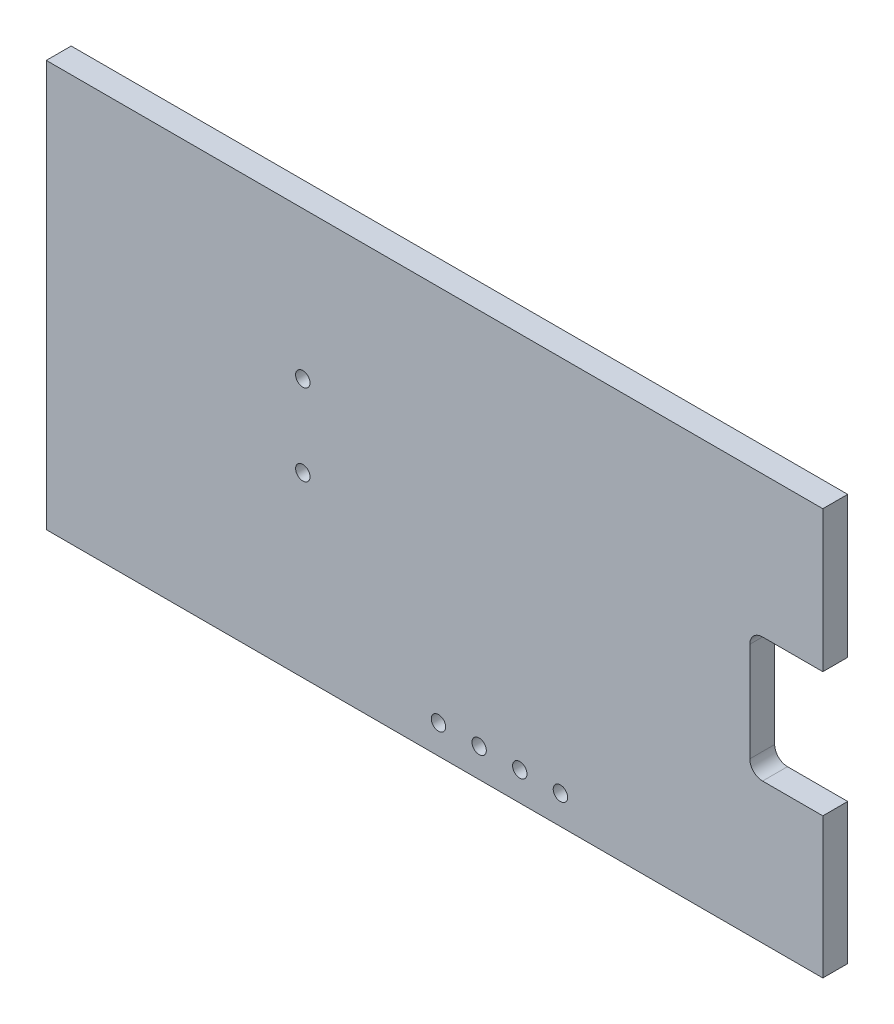
ISO-10303-21;
HEADER;
FILE_DESCRIPTION(('STEP AP214'),'2;1');
FILE_NAME('part.step','',(''),(''),'','','');
FILE_SCHEMA(('AUTOMOTIVE_DESIGN { 1 0 10303 214 1 1 1 1 }'));
ENDSEC;
DATA;
#1=APPLICATION_CONTEXT('core data for automotive mechanical design processes');
#2=APPLICATION_PROTOCOL_DEFINITION('international standard','automotive_design',2000,#1);
#3=PRODUCT_CONTEXT('',#1,'mechanical');
#4=PRODUCT('Part','Part','',(#3));
#5=PRODUCT_RELATED_PRODUCT_CATEGORY('part','',(#4));
#6=PRODUCT_DEFINITION_FORMATION('','',#4);
#7=PRODUCT_DEFINITION_CONTEXT('part definition',#1,'design');
#8=PRODUCT_DEFINITION('design','',#6,#7);
#9=PRODUCT_DEFINITION_SHAPE('','',#8);
#10=(LENGTH_UNIT() NAMED_UNIT(*) SI_UNIT(.MILLI.,.METRE.));
#11=(NAMED_UNIT(*) PLANE_ANGLE_UNIT() SI_UNIT($,.RADIAN.));
#12=(NAMED_UNIT(*) SI_UNIT($,.STERADIAN.) SOLID_ANGLE_UNIT());
#13=UNCERTAINTY_MEASURE_WITH_UNIT(LENGTH_MEASURE(1.E-05),#10,'distance_accuracy_value','');
#14=(GEOMETRIC_REPRESENTATION_CONTEXT(3) GLOBAL_UNCERTAINTY_ASSIGNED_CONTEXT((#13)) GLOBAL_UNIT_ASSIGNED_CONTEXT((#10,
#11,#12)) REPRESENTATION_CONTEXT('',''));
#15=CARTESIAN_POINT('',(0.,0.,0.));
#16=DIRECTION('',(0.,0.,1.));
#17=DIRECTION('',(1.,0.,0.));
#18=AXIS2_PLACEMENT_3D('',#15,#16,#17);
#19=CARTESIAN_POINT('',(91.56800076,85.90000092,1.55600146));
#20=DIRECTION('',(0.,0.,1.));
#21=DIRECTION('',(1.,0.,0.));
#22=AXIS2_PLACEMENT_3D('',#19,#20,#21);
#23=PLANE('',#22);
#24=CARTESIAN_POINT('',(107.6000007,102.07999904,1.55600146));
#25=DIRECTION('',(0.,0.,-1.));
#26=DIRECTION('',(-1.,0.,0.));
#27=AXIS2_PLACEMENT_3D('',#24,#25,#26);
#28=CIRCLE('',#27,0.4499991);
#29=CARTESIAN_POINT('',(107.1500016,102.07999904,1.55600146));
#30=VERTEX_POINT('',#29);
#31=EDGE_CURVE('E147',#30,#30,#28,.T.);
#32=ORIENTED_EDGE('',*,*,#31,.T.);
#33=EDGE_LOOP('',(#32));
#34=FACE_BOUND('',#33,.T.);
#35=CARTESIAN_POINT('',(107.6000007,96.99999904,1.55600146));
#36=DIRECTION('',(0.,0.,-1.));
#37=DIRECTION('',(-1.,0.,0.));
#38=AXIS2_PLACEMENT_3D('',#35,#36,#37);
#39=CIRCLE('',#38,0.4499991);
#40=CARTESIAN_POINT('',(107.1500016,96.99999904,1.55600146));
#41=VERTEX_POINT('',#40);
#42=EDGE_CURVE('E214',#41,#41,#39,.T.);
#43=ORIENTED_EDGE('',*,*,#42,.T.);
#44=EDGE_LOOP('',(#43));
#45=FACE_BOUND('',#44,.T.);
#46=CARTESIAN_POINT('',(116.07999898,87.69999986,1.55600146));
#47=DIRECTION('',(0.,0.,-1.));
#48=DIRECTION('',(-1.,0.,0.));
#49=AXIS2_PLACEMENT_3D('',#46,#47,#48);
#50=CIRCLE('',#49,0.4499991);
#51=CARTESIAN_POINT('',(115.62999988,87.69999986,1.55600146));
#52=VERTEX_POINT('',#51);
#53=EDGE_CURVE('E217',#52,#52,#50,.T.);
#54=ORIENTED_EDGE('',*,*,#53,.T.);
#55=EDGE_LOOP('',(#54));
#56=FACE_BOUND('',#55,.T.);
#57=CARTESIAN_POINT('',(118.61999898,87.69999986,1.55600146));
#58=DIRECTION('',(0.,0.,-1.));
#59=DIRECTION('',(-1.,0.,0.));
#60=AXIS2_PLACEMENT_3D('',#57,#58,#59);
#61=CIRCLE('',#60,0.4499991);
#62=CARTESIAN_POINT('',(118.16999988,87.69999986,1.55600146));
#63=VERTEX_POINT('',#62);
#64=EDGE_CURVE('E220',#63,#63,#61,.T.);
#65=ORIENTED_EDGE('',*,*,#64,.T.);
#66=EDGE_LOOP('',(#65));
#67=FACE_BOUND('',#66,.T.);
#68=CARTESIAN_POINT('',(121.15999898,87.69999986,1.55600146));
#69=DIRECTION('',(0.,0.,-1.));
#70=DIRECTION('',(-1.,0.,0.));
#71=AXIS2_PLACEMENT_3D('',#68,#69,#70);
#72=CIRCLE('',#71,0.4499991);
#73=CARTESIAN_POINT('',(120.70999988,87.69999986,1.55600146));
#74=VERTEX_POINT('',#73);
#75=EDGE_CURVE('E223',#74,#74,#72,.T.);
#76=ORIENTED_EDGE('',*,*,#75,.T.);
#77=EDGE_LOOP('',(#76));
#78=FACE_BOUND('',#77,.T.);
#79=CARTESIAN_POINT('',(123.69999898,87.69999986,1.55600146));
#80=DIRECTION('',(0.,0.,-1.));
#81=DIRECTION('',(-1.,0.,0.));
#82=AXIS2_PLACEMENT_3D('',#79,#80,#81);
#83=CIRCLE('',#82,0.4499991);
#84=CARTESIAN_POINT('',(123.24999988,87.69999986,1.55600146));
#85=VERTEX_POINT('',#84);
#86=EDGE_CURVE('E181',#85,#85,#83,.T.);
#87=ORIENTED_EDGE('',*,*,#86,.T.);
#88=EDGE_LOOP('',(#87));
#89=FACE_BOUND('',#88,.T.);
#90=DIRECTION('',(0.,1.,0.));
#91=VECTOR('',#90,1.);
#92=CARTESIAN_POINT('',(140.0999992,111.30000092,1.55600146));
#93=LINE('',#92,#91);
#94=CARTESIAN_POINT('',(140.0999992,111.30000092,1.55600146));
#95=VERTEX_POINT('',#94);
#96=CARTESIAN_POINT('',(140.0999992,102.47739982,1.55600146));
#97=VERTEX_POINT('',#96);
#98=EDGE_CURVE('E173',#95,#97,#93,.F.);
#99=ORIENTED_EDGE('',*,*,#98,.F.);
#100=DIRECTION('',(1.,0.,0.));
#101=VECTOR('',#100,1.);
#102=CARTESIAN_POINT('',(91.56800076,111.30000092,1.55600146));
#103=LINE('',#102,#101);
#104=CARTESIAN_POINT('',(91.56800076,111.30000092,1.55600146));
#105=VERTEX_POINT('',#104);
#106=EDGE_CURVE('E153',#105,#95,#103,.T.);
#107=ORIENTED_EDGE('',*,*,#106,.F.);
#108=DIRECTION('',(0.,1.,0.));
#109=VECTOR('',#108,1.);
#110=CARTESIAN_POINT('',(91.56800076,85.90000092,1.55600146));
#111=LINE('',#110,#109);
#112=CARTESIAN_POINT('',(91.56800076,85.90000092,1.55600146));
#113=VERTEX_POINT('',#112);
#114=EDGE_CURVE('E163',#113,#105,#111,.T.);
#115=ORIENTED_EDGE('',*,*,#114,.F.);
#116=DIRECTION('',(1.,0.,0.));
#117=VECTOR('',#116,1.);
#118=CARTESIAN_POINT('',(140.0999992,85.90000092,1.55600146));
#119=LINE('',#118,#117);
#120=CARTESIAN_POINT('',(140.0999992,85.90000092,1.55600146));
#121=VERTEX_POINT('',#120);
#122=EDGE_CURVE('E142',#121,#113,#119,.F.);
#123=ORIENTED_EDGE('',*,*,#122,.F.);
#124=DIRECTION('',(0.,1.,0.));
#125=VECTOR('',#124,1.);
#126=CARTESIAN_POINT('',(140.0999992,94.67740018,1.55600146));
#127=LINE('',#126,#125);
#128=CARTESIAN_POINT('',(140.0999992,94.67740018,1.55600146));
#129=VERTEX_POINT('',#128);
#130=EDGE_CURVE('E132',#129,#121,#127,.F.);
#131=ORIENTED_EDGE('',*,*,#130,.F.);
#132=DIRECTION('',(1.,0.,0.));
#133=VECTOR('',#132,1.);
#134=CARTESIAN_POINT('',(140.0999992,94.67740018,1.55600146));
#135=LINE('',#134,#133);
#136=CARTESIAN_POINT('',(136.33440119543,94.6774001800001,1.55600146));
#137=VERTEX_POINT('',#136);
#138=EDGE_CURVE('E91',#129,#137,#135,.F.);
#139=ORIENTED_EDGE('',*,*,#138,.T.);
#140=CARTESIAN_POINT('',(136.33440145086,95.477401630868,1.55600146));
#141=DIRECTION('',(0.,0.,-1.));
#142=DIRECTION('',(-1.,0.,0.));
#143=AXIS2_PLACEMENT_3D('',#140,#141,#142);
#144=CIRCLE('',#143,0.800001450868);
#145=CARTESIAN_POINT('',(135.5344,95.477401375434,1.55600146));
#146=VERTEX_POINT('',#145);
#147=EDGE_CURVE('E20',#137,#146,#144,.T.);
#148=ORIENTED_EDGE('',*,*,#147,.T.);
#149=DIRECTION('',(0.,1.,0.));
#150=VECTOR('',#149,1.);
#151=CARTESIAN_POINT('',(135.5344,95.47740112,1.55600146));
#152=LINE('',#151,#150);
#153=CARTESIAN_POINT('',(135.534399999996,101.67739836913,1.55600146));
#154=VERTEX_POINT('',#153);
#155=EDGE_CURVE('E95',#146,#154,#152,.T.);
#156=ORIENTED_EDGE('',*,*,#155,.T.);
#157=CARTESIAN_POINT('',(136.33440145086,101.67739836913,1.55600146));
#158=DIRECTION('',(0.,0.,-1.));
#159=DIRECTION('',(-1.,0.,0.));
#160=AXIS2_PLACEMENT_3D('',#157,#158,#159);
#161=CIRCLE('',#160,0.800001450868);
#162=CARTESIAN_POINT('',(136.33440119543,102.47739982,1.55600146));
#163=VERTEX_POINT('',#162);
#164=EDGE_CURVE('E227',#154,#163,#161,.T.);
#165=ORIENTED_EDGE('',*,*,#164,.T.);
#166=DIRECTION('',(1.,0.,0.));
#167=VECTOR('',#166,1.);
#168=CARTESIAN_POINT('',(136.33440094,102.47739982,1.55600146));
#169=LINE('',#168,#167);
#170=EDGE_CURVE('E170',#163,#97,#169,.T.);
#171=ORIENTED_EDGE('',*,*,#170,.T.);
#172=EDGE_LOOP('',(#99,#107,#115,#123,#131,#139,#148,#156,#165,#171));
#173=FACE_BOUND('',#172,.T.);
#174=ADVANCED_FACE('F17',(#34,#45,#56,#67,#78,#89,#173),#23,.T.);
#175=CARTESIAN_POINT('',(91.56800076,85.90000092,0.));
#176=DIRECTION('',(-1.,0.,0.));
#177=DIRECTION('',(0.,0.,1.));
#178=AXIS2_PLACEMENT_3D('',#175,#176,#177);
#179=PLANE('',#178);
#180=DIRECTION('',(0.,0.,1.));
#181=VECTOR('',#180,1.);
#182=CARTESIAN_POINT('',(91.56800076,111.30000092,0.));
#183=LINE('',#182,#181);
#184=CARTESIAN_POINT('',(91.56800076,111.30000092,0.));
#185=VERTEX_POINT('',#184);
#186=EDGE_CURVE('E150',#185,#105,#183,.T.);
#187=ORIENTED_EDGE('',*,*,#186,.F.);
#188=DIRECTION('',(0.,1.,0.));
#189=VECTOR('',#188,1.);
#190=CARTESIAN_POINT('',(91.56800076,85.90000092,0.));
#191=LINE('',#190,#189);
#192=CARTESIAN_POINT('',(91.56800076,85.90000092,0.));
#193=VERTEX_POINT('',#192);
#194=EDGE_CURVE('E137',#185,#193,#191,.F.);
#195=ORIENTED_EDGE('',*,*,#194,.T.);
#196=DIRECTION('',(0.,0.,-1.));
#197=VECTOR('',#196,1.);
#198=CARTESIAN_POINT('',(91.56800076,85.90000092,0.));
#199=LINE('',#198,#197);
#200=EDGE_CURVE('E140',#113,#193,#199,.T.);
#201=ORIENTED_EDGE('',*,*,#200,.F.);
#202=ORIENTED_EDGE('',*,*,#114,.T.);
#203=EDGE_LOOP('',(#187,#195,#201,#202));
#204=FACE_BOUND('',#203,.T.);
#205=ADVANCED_FACE('F272',(#204),#179,.T.);
#206=CARTESIAN_POINT('',(140.0999992,85.90000092,0.));
#207=DIRECTION('',(0.,-1.,0.));
#208=DIRECTION('',(0.,0.,-1.));
#209=AXIS2_PLACEMENT_3D('',#206,#207,#208);
#210=PLANE('',#209);
#211=ORIENTED_EDGE('',*,*,#200,.T.);
#212=DIRECTION('',(1.,0.,0.));
#213=VECTOR('',#212,1.);
#214=CARTESIAN_POINT('',(91.56800076,85.90000092,0.));
#215=LINE('',#214,#213);
#216=CARTESIAN_POINT('',(140.0999992,85.90000092,0.));
#217=VERTEX_POINT('',#216);
#218=EDGE_CURVE('E128',#193,#217,#215,.T.);
#219=ORIENTED_EDGE('',*,*,#218,.T.);
#220=DIRECTION('',(0.,0.,-1.));
#221=VECTOR('',#220,1.);
#222=CARTESIAN_POINT('',(140.0999992,85.90000092,0.));
#223=LINE('',#222,#221);
#224=EDGE_CURVE('E121',#121,#217,#223,.T.);
#225=ORIENTED_EDGE('',*,*,#224,.F.);
#226=ORIENTED_EDGE('',*,*,#122,.T.);
#227=EDGE_LOOP('',(#211,#219,#225,#226));
#228=FACE_BOUND('',#227,.T.);
#229=ADVANCED_FACE('F267',(#228),#210,.T.);
#230=CARTESIAN_POINT('',(140.0999992,94.67740018,0.));
#231=DIRECTION('',(1.,0.,0.));
#232=DIRECTION('',(0.,0.,-1.));
#233=AXIS2_PLACEMENT_3D('',#230,#231,#232);
#234=PLANE('',#233);
#235=ORIENTED_EDGE('',*,*,#224,.T.);
#236=DIRECTION('',(0.,1.,0.));
#237=VECTOR('',#236,1.);
#238=CARTESIAN_POINT('',(140.0999992,85.90000092,0.));
#239=LINE('',#238,#237);
#240=CARTESIAN_POINT('',(140.0999992,94.67740018,0.));
#241=VERTEX_POINT('',#240);
#242=EDGE_CURVE('E124',#217,#241,#239,.T.);
#243=ORIENTED_EDGE('',*,*,#242,.T.);
#244=DIRECTION('',(0.,0.,-1.));
#245=VECTOR('',#244,1.);
#246=CARTESIAN_POINT('',(140.0999992,94.67740018,0.));
#247=LINE('',#246,#245);
#248=EDGE_CURVE('E118',#241,#129,#247,.F.);
#249=ORIENTED_EDGE('',*,*,#248,.T.);
#250=ORIENTED_EDGE('',*,*,#130,.T.);
#251=EDGE_LOOP('',(#235,#243,#249,#250));
#252=FACE_BOUND('',#251,.T.);
#253=ADVANCED_FACE('F263',(#252),#234,.T.);
#254=CARTESIAN_POINT('',(140.0999992,94.67740018,0.));
#255=DIRECTION('',(0.,-1.,0.));
#256=DIRECTION('',(0.,0.,-1.));
#257=AXIS2_PLACEMENT_3D('',#254,#255,#256);
#258=PLANE('',#257);
#259=DIRECTION('',(0.,0.,-1.));
#260=VECTOR('',#259,1.);
#261=CARTESIAN_POINT('',(136.33440094,94.6774001800002,0.));
#262=LINE('',#261,#260);
#263=CARTESIAN_POINT('',(136.33440119543,94.6774001800001,0.));
#264=VERTEX_POINT('',#263);
#265=EDGE_CURVE('E101',#264,#137,#262,.F.);
#266=ORIENTED_EDGE('',*,*,#265,.T.);
#267=ORIENTED_EDGE('',*,*,#138,.F.);
#268=ORIENTED_EDGE('',*,*,#248,.F.);
#269=DIRECTION('',(1.,0.,0.));
#270=VECTOR('',#269,1.);
#271=CARTESIAN_POINT('',(91.56800076,94.67740018,0.));
#272=LINE('',#271,#270);
#273=EDGE_CURVE('E127',#241,#264,#272,.F.);
#274=ORIENTED_EDGE('',*,*,#273,.T.);
#275=EDGE_LOOP('',(#266,#267,#268,#274));
#276=FACE_BOUND('',#275,.T.);
#277=ADVANCED_FACE('F259',(#276),#258,.F.);
#278=CARTESIAN_POINT('',(136.33440145086,95.477401630868,0.));
#279=DIRECTION('',(0.,0.,-1.));
#280=DIRECTION('',(-1.,0.,0.));
#281=AXIS2_PLACEMENT_3D('',#278,#279,#280);
#282=CYLINDRICAL_SURFACE('',#281,0.800001450868);
#283=DIRECTION('',(0.,0.,1.));
#284=VECTOR('',#283,1.);
#285=CARTESIAN_POINT('',(135.5344,95.47740112,0.));
#286=LINE('',#285,#284);
#287=CARTESIAN_POINT('',(135.5344,95.477401375434,0.));
#288=VERTEX_POINT('',#287);
#289=EDGE_CURVE('E100',#288,#146,#286,.T.);
#290=ORIENTED_EDGE('',*,*,#289,.T.);
#291=ORIENTED_EDGE('',*,*,#147,.F.);
#292=ORIENTED_EDGE('',*,*,#265,.F.);
#293=CARTESIAN_POINT('',(136.33440145086,95.477401630868,0.));
#294=DIRECTION('',(0.,0.,-1.));
#295=DIRECTION('',(-1.,0.,0.));
#296=AXIS2_PLACEMENT_3D('',#293,#294,#295);
#297=CIRCLE('',#296,0.800001450868);
#298=EDGE_CURVE('E112',#264,#288,#297,.T.);
#299=ORIENTED_EDGE('',*,*,#298,.T.);
#300=EDGE_LOOP('',(#290,#291,#292,#299));
#301=FACE_BOUND('',#300,.T.);
#302=ADVANCED_FACE('F110',(#301),#282,.F.);
#303=CARTESIAN_POINT('',(135.5344,95.47740112,0.));
#304=DIRECTION('',(-1.,0.,0.));
#305=DIRECTION('',(0.,0.,1.));
#306=AXIS2_PLACEMENT_3D('',#303,#304,#305);
#307=PLANE('',#306);
#308=DIRECTION('',(0.,0.,-1.));
#309=VECTOR('',#308,1.);
#310=CARTESIAN_POINT('',(135.534399999992,101.67739836913,0.));
#311=LINE('',#310,#309);
#312=CARTESIAN_POINT('',(135.534399999996,101.67739836913,0.));
#313=VERTEX_POINT('',#312);
#314=EDGE_CURVE('E107',#313,#154,#311,.F.);
#315=ORIENTED_EDGE('',*,*,#314,.T.);
#316=ORIENTED_EDGE('',*,*,#155,.F.);
#317=ORIENTED_EDGE('',*,*,#289,.F.);
#318=DIRECTION('',(0.,1.,0.));
#319=VECTOR('',#318,1.);
#320=CARTESIAN_POINT('',(135.5344,85.90000092,0.));
#321=LINE('',#320,#319);
#322=EDGE_CURVE('E210',#288,#313,#321,.T.);
#323=ORIENTED_EDGE('',*,*,#322,.T.);
#324=EDGE_LOOP('',(#315,#316,#317,#323));
#325=FACE_BOUND('',#324,.T.);
#326=ADVANCED_FACE('F104',(#325),#307,.F.);
#327=CARTESIAN_POINT('',(136.33440145086,101.67739836913,0.));
#328=DIRECTION('',(0.,0.,-1.));
#329=DIRECTION('',(-1.,0.,0.));
#330=AXIS2_PLACEMENT_3D('',#327,#328,#329);
#331=CYLINDRICAL_SURFACE('',#330,0.800001450868);
#332=DIRECTION('',(0.,0.,1.));
#333=VECTOR('',#332,1.);
#334=CARTESIAN_POINT('',(136.33440094,102.47739982,0.));
#335=LINE('',#334,#333);
#336=CARTESIAN_POINT('',(136.33440119543,102.47739982,0.));
#337=VERTEX_POINT('',#336);
#338=EDGE_CURVE('E174',#337,#163,#335,.T.);
#339=ORIENTED_EDGE('',*,*,#338,.T.);
#340=ORIENTED_EDGE('',*,*,#164,.F.);
#341=ORIENTED_EDGE('',*,*,#314,.F.);
#342=CARTESIAN_POINT('',(136.33440145086,101.67739836913,0.));
#343=DIRECTION('',(0.,0.,-1.));
#344=DIRECTION('',(-1.,0.,0.));
#345=AXIS2_PLACEMENT_3D('',#342,#343,#344);
#346=CIRCLE('',#345,0.800001450868);
#347=EDGE_CURVE('E206',#313,#337,#346,.T.);
#348=ORIENTED_EDGE('',*,*,#347,.T.);
#349=EDGE_LOOP('',(#339,#340,#341,#348));
#350=FACE_BOUND('',#349,.T.);
#351=ADVANCED_FACE('F359',(#350),#331,.F.);
#352=CARTESIAN_POINT('',(136.33440094,102.47739982,0.));
#353=DIRECTION('',(0.,1.,0.));
#354=DIRECTION('',(0.,0.,1.));
#355=AXIS2_PLACEMENT_3D('',#352,#353,#354);
#356=PLANE('',#355);
#357=DIRECTION('',(0.,0.,-1.));
#358=VECTOR('',#357,1.);
#359=CARTESIAN_POINT('',(140.0999992,102.47739982,0.));
#360=LINE('',#359,#358);
#361=CARTESIAN_POINT('',(140.0999992,102.47739982,0.));
#362=VERTEX_POINT('',#361);
#363=EDGE_CURVE('E154',#97,#362,#360,.T.);
#364=ORIENTED_EDGE('',*,*,#363,.F.);
#365=ORIENTED_EDGE('',*,*,#170,.F.);
#366=ORIENTED_EDGE('',*,*,#338,.F.);
#367=DIRECTION('',(1.,0.,0.));
#368=VECTOR('',#367,1.);
#369=CARTESIAN_POINT('',(91.56800076,102.47739982,0.));
#370=LINE('',#369,#368);
#371=EDGE_CURVE('E209',#337,#362,#370,.T.);
#372=ORIENTED_EDGE('',*,*,#371,.T.);
#373=EDGE_LOOP('',(#364,#365,#366,#372));
#374=FACE_BOUND('',#373,.T.);
#375=ADVANCED_FACE('F251',(#374),#356,.F.);
#376=CARTESIAN_POINT('',(140.0999992,111.30000092,0.));
#377=DIRECTION('',(1.,0.,0.));
#378=DIRECTION('',(0.,0.,-1.));
#379=AXIS2_PLACEMENT_3D('',#376,#377,#378);
#380=PLANE('',#379);
#381=ORIENTED_EDGE('',*,*,#363,.T.);
#382=DIRECTION('',(0.,1.,0.));
#383=VECTOR('',#382,1.);
#384=CARTESIAN_POINT('',(140.0999992,85.90000092,0.));
#385=LINE('',#384,#383);
#386=CARTESIAN_POINT('',(140.0999992,111.30000092,0.));
#387=VERTEX_POINT('',#386);
#388=EDGE_CURVE('E160',#362,#387,#385,.T.);
#389=ORIENTED_EDGE('',*,*,#388,.T.);
#390=DIRECTION('',(0.,0.,1.));
#391=VECTOR('',#390,1.);
#392=CARTESIAN_POINT('',(140.0999992,111.30000092,0.));
#393=LINE('',#392,#391);
#394=EDGE_CURVE('E35',#95,#387,#393,.F.);
#395=ORIENTED_EDGE('',*,*,#394,.F.);
#396=ORIENTED_EDGE('',*,*,#98,.T.);
#397=EDGE_LOOP('',(#381,#389,#395,#396));
#398=FACE_BOUND('',#397,.T.);
#399=ADVANCED_FACE('F244',(#398),#380,.T.);
#400=CARTESIAN_POINT('',(91.56800076,111.30000092,0.));
#401=DIRECTION('',(0.,1.,0.));
#402=DIRECTION('',(0.,0.,1.));
#403=AXIS2_PLACEMENT_3D('',#400,#401,#402);
#404=PLANE('',#403);
#405=ORIENTED_EDGE('',*,*,#394,.T.);
#406=DIRECTION('',(1.,0.,0.));
#407=VECTOR('',#406,1.);
#408=CARTESIAN_POINT('',(91.56800076,111.30000092,0.));
#409=LINE('',#408,#407);
#410=EDGE_CURVE('E157',#387,#185,#409,.F.);
#411=ORIENTED_EDGE('',*,*,#410,.T.);
#412=ORIENTED_EDGE('',*,*,#186,.T.);
#413=ORIENTED_EDGE('',*,*,#106,.T.);
#414=EDGE_LOOP('',(#405,#411,#412,#413));
#415=FACE_BOUND('',#414,.T.);
#416=ADVANCED_FACE('F274',(#415),#404,.T.);
#417=CARTESIAN_POINT('',(123.69999898,87.69999986,0.));
#418=DIRECTION('',(0.,0.,-1.));
#419=DIRECTION('',(-1.,0.,0.));
#420=AXIS2_PLACEMENT_3D('',#417,#418,#419);
#421=CYLINDRICAL_SURFACE('',#420,0.4499991);
#422=ORIENTED_EDGE('',*,*,#86,.F.);
#423=EDGE_LOOP('',(#422));
#424=FACE_BOUND('',#423,.T.);
#425=CARTESIAN_POINT('',(123.69999898,87.69999986,0.));
#426=DIRECTION('',(0.,0.,-1.));
#427=DIRECTION('',(-1.,0.,0.));
#428=AXIS2_PLACEMENT_3D('',#425,#426,#427);
#429=CIRCLE('',#428,0.4499991);
#430=CARTESIAN_POINT('',(123.24999988,87.69999986,0.));
#431=VERTEX_POINT('',#430);
#432=EDGE_CURVE('E159',#431,#431,#429,.T.);
#433=ORIENTED_EDGE('',*,*,#432,.T.);
#434=EDGE_LOOP('',(#433));
#435=FACE_BOUND('',#434,.T.);
#436=ADVANCED_FACE('F276',(#424,#435),#421,.F.);
#437=CARTESIAN_POINT('',(121.15999898,87.69999986,0.));
#438=DIRECTION('',(0.,0.,-1.));
#439=DIRECTION('',(-1.,0.,0.));
#440=AXIS2_PLACEMENT_3D('',#437,#438,#439);
#441=CYLINDRICAL_SURFACE('',#440,0.4499991);
#442=ORIENTED_EDGE('',*,*,#75,.F.);
#443=EDGE_LOOP('',(#442));
#444=FACE_BOUND('',#443,.T.);
#445=CARTESIAN_POINT('',(121.15999898,87.69999986,0.));
#446=DIRECTION('',(0.,0.,-1.));
#447=DIRECTION('',(-1.,0.,0.));
#448=AXIS2_PLACEMENT_3D('',#445,#446,#447);
#449=CIRCLE('',#448,0.4499991);
#450=CARTESIAN_POINT('',(120.70999988,87.69999986,0.));
#451=VERTEX_POINT('',#450);
#452=EDGE_CURVE('E201',#451,#451,#449,.T.);
#453=ORIENTED_EDGE('',*,*,#452,.T.);
#454=EDGE_LOOP('',(#453));
#455=FACE_BOUND('',#454,.T.);
#456=ADVANCED_FACE('F283',(#444,#455),#441,.F.);
#457=CARTESIAN_POINT('',(118.61999898,87.69999986,0.));
#458=DIRECTION('',(0.,0.,-1.));
#459=DIRECTION('',(-1.,0.,0.));
#460=AXIS2_PLACEMENT_3D('',#457,#458,#459);
#461=CYLINDRICAL_SURFACE('',#460,0.4499991);
#462=ORIENTED_EDGE('',*,*,#64,.F.);
#463=EDGE_LOOP('',(#462));
#464=FACE_BOUND('',#463,.T.);
#465=CARTESIAN_POINT('',(118.61999898,87.69999986,0.));
#466=DIRECTION('',(0.,0.,-1.));
#467=DIRECTION('',(-1.,0.,0.));
#468=AXIS2_PLACEMENT_3D('',#465,#466,#467);
#469=CIRCLE('',#468,0.4499991);
#470=CARTESIAN_POINT('',(118.16999988,87.69999986,0.));
#471=VERTEX_POINT('',#470);
#472=EDGE_CURVE('E198',#471,#471,#469,.T.);
#473=ORIENTED_EDGE('',*,*,#472,.T.);
#474=EDGE_LOOP('',(#473));
#475=FACE_BOUND('',#474,.T.);
#476=ADVANCED_FACE('F306',(#464,#475),#461,.F.);
#477=CARTESIAN_POINT('',(116.07999898,87.69999986,0.));
#478=DIRECTION('',(0.,0.,-1.));
#479=DIRECTION('',(-1.,0.,0.));
#480=AXIS2_PLACEMENT_3D('',#477,#478,#479);
#481=CYLINDRICAL_SURFACE('',#480,0.4499991);
#482=ORIENTED_EDGE('',*,*,#53,.F.);
#483=EDGE_LOOP('',(#482));
#484=FACE_BOUND('',#483,.T.);
#485=CARTESIAN_POINT('',(116.07999898,87.69999986,0.));
#486=DIRECTION('',(0.,0.,-1.));
#487=DIRECTION('',(-1.,0.,0.));
#488=AXIS2_PLACEMENT_3D('',#485,#486,#487);
#489=CIRCLE('',#488,0.4499991);
#490=CARTESIAN_POINT('',(115.62999988,87.69999986,0.));
#491=VERTEX_POINT('',#490);
#492=EDGE_CURVE('E195',#491,#491,#489,.T.);
#493=ORIENTED_EDGE('',*,*,#492,.T.);
#494=EDGE_LOOP('',(#493));
#495=FACE_BOUND('',#494,.T.);
#496=ADVANCED_FACE('F302',(#484,#495),#481,.F.);
#497=CARTESIAN_POINT('',(107.6000007,96.99999904,0.));
#498=DIRECTION('',(0.,0.,-1.));
#499=DIRECTION('',(-1.,0.,0.));
#500=AXIS2_PLACEMENT_3D('',#497,#498,#499);
#501=CYLINDRICAL_SURFACE('',#500,0.4499991);
#502=ORIENTED_EDGE('',*,*,#42,.F.);
#503=EDGE_LOOP('',(#502));
#504=FACE_BOUND('',#503,.T.);
#505=CARTESIAN_POINT('',(107.6000007,96.99999904,0.));
#506=DIRECTION('',(0.,0.,-1.));
#507=DIRECTION('',(-1.,0.,0.));
#508=AXIS2_PLACEMENT_3D('',#505,#506,#507);
#509=CIRCLE('',#508,0.4499991);
#510=CARTESIAN_POINT('',(107.1500016,96.99999904,0.));
#511=VERTEX_POINT('',#510);
#512=EDGE_CURVE('E26',#511,#511,#509,.T.);
#513=ORIENTED_EDGE('',*,*,#512,.T.);
#514=EDGE_LOOP('',(#513));
#515=FACE_BOUND('',#514,.T.);
#516=ADVANCED_FACE('F294',(#504,#515),#501,.F.);
#517=CARTESIAN_POINT('',(107.6000007,102.07999904,0.));
#518=DIRECTION('',(0.,0.,-1.));
#519=DIRECTION('',(-1.,0.,0.));
#520=AXIS2_PLACEMENT_3D('',#517,#518,#519);
#521=CYLINDRICAL_SURFACE('',#520,0.4499991);
#522=ORIENTED_EDGE('',*,*,#31,.F.);
#523=EDGE_LOOP('',(#522));
#524=FACE_BOUND('',#523,.T.);
#525=CARTESIAN_POINT('',(107.6000007,102.07999904,0.));
#526=DIRECTION('',(0.,0.,-1.));
#527=DIRECTION('',(-1.,0.,0.));
#528=AXIS2_PLACEMENT_3D('',#525,#526,#527);
#529=CIRCLE('',#528,0.4499991);
#530=CARTESIAN_POINT('',(107.1500016,102.07999904,0.));
#531=VERTEX_POINT('',#530);
#532=EDGE_CURVE('E11',#531,#531,#529,.T.);
#533=ORIENTED_EDGE('',*,*,#532,.T.);
#534=EDGE_LOOP('',(#533));
#535=FACE_BOUND('',#534,.T.);
#536=ADVANCED_FACE('F288',(#524,#535),#521,.F.);
#537=CARTESIAN_POINT('',(91.56800076,85.90000092,0.));
#538=DIRECTION('',(0.,0.,1.));
#539=DIRECTION('',(1.,0.,0.));
#540=AXIS2_PLACEMENT_3D('',#537,#538,#539);
#541=PLANE('',#540);
#542=ORIENTED_EDGE('',*,*,#532,.F.);
#543=EDGE_LOOP('',(#542));
#544=FACE_BOUND('',#543,.T.);
#545=ORIENTED_EDGE('',*,*,#512,.F.);
#546=EDGE_LOOP('',(#545));
#547=FACE_BOUND('',#546,.T.);
#548=ORIENTED_EDGE('',*,*,#492,.F.);
#549=EDGE_LOOP('',(#548));
#550=FACE_BOUND('',#549,.T.);
#551=ORIENTED_EDGE('',*,*,#472,.F.);
#552=EDGE_LOOP('',(#551));
#553=FACE_BOUND('',#552,.T.);
#554=ORIENTED_EDGE('',*,*,#452,.F.);
#555=EDGE_LOOP('',(#554));
#556=FACE_BOUND('',#555,.T.);
#557=ORIENTED_EDGE('',*,*,#432,.F.);
#558=EDGE_LOOP('',(#557));
#559=FACE_BOUND('',#558,.T.);
#560=ORIENTED_EDGE('',*,*,#388,.F.);
#561=ORIENTED_EDGE('',*,*,#371,.F.);
#562=ORIENTED_EDGE('',*,*,#347,.F.);
#563=ORIENTED_EDGE('',*,*,#322,.F.);
#564=ORIENTED_EDGE('',*,*,#298,.F.);
#565=ORIENTED_EDGE('',*,*,#273,.F.);
#566=ORIENTED_EDGE('',*,*,#242,.F.);
#567=ORIENTED_EDGE('',*,*,#218,.F.);
#568=ORIENTED_EDGE('',*,*,#194,.F.);
#569=ORIENTED_EDGE('',*,*,#410,.F.);
#570=EDGE_LOOP('',(#560,#561,#562,#563,#564,#565,#566,#567,#568,#569));
#571=FACE_BOUND('',#570,.T.);
#572=ADVANCED_FACE('F249',(#544,#547,#550,#553,#556,#559,#571),#541,.F.);
#573=CLOSED_SHELL('',(#174,#205,#229,#253,#277,#302,#326,#351,#375,#399,#416,#436,#456,#476,
#496,#516,#536,#572));
#574=MANIFOLD_SOLID_BREP('B1',#573);
#575=ADVANCED_BREP_SHAPE_REPRESENTATION('',(#18,#574),#14);
#576=SHAPE_DEFINITION_REPRESENTATION(#9,#575);
ENDSEC;
END-ISO-10303-21;
